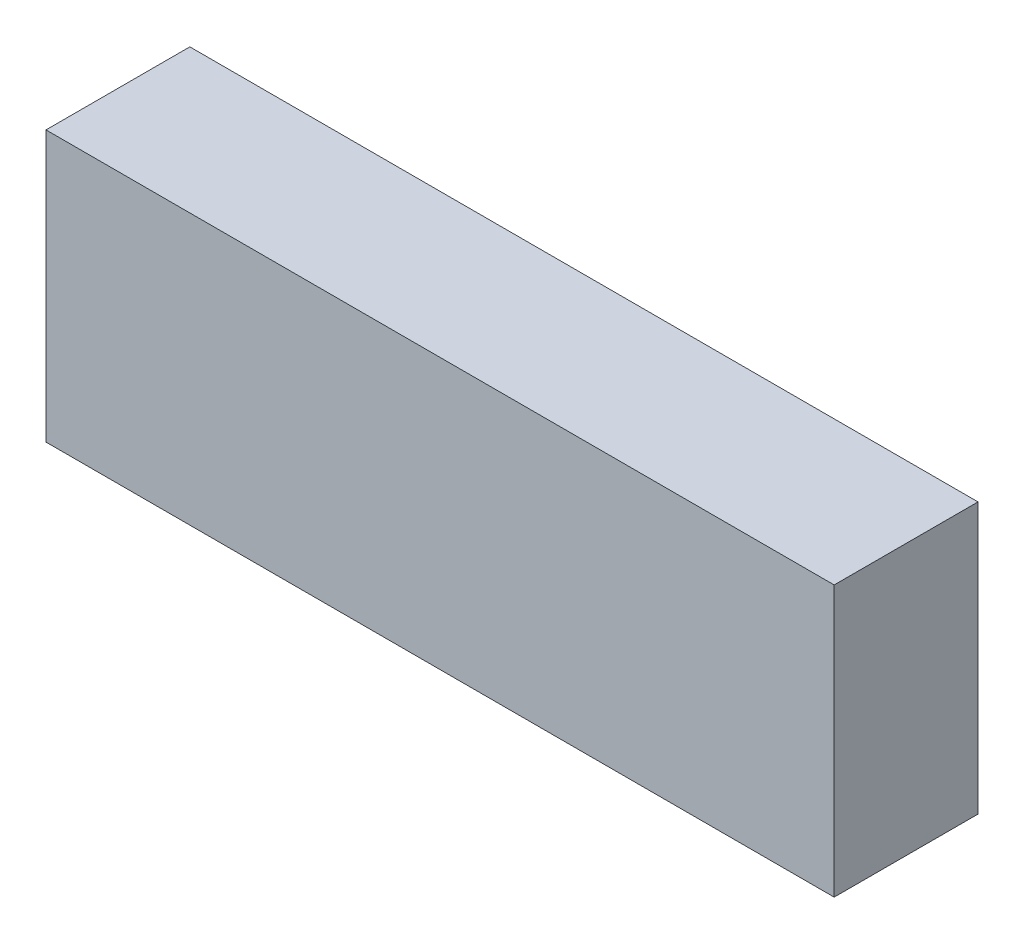
ISO-10303-21;
HEADER;
FILE_DESCRIPTION(('STEP AP214'),'2;1');
FILE_NAME('part.step','',(''),(''),'','','');
FILE_SCHEMA(('AUTOMOTIVE_DESIGN { 1 0 10303 214 1 1 1 1 }'));
ENDSEC;
DATA;
#1=APPLICATION_CONTEXT('core data for automotive mechanical design processes');
#2=APPLICATION_PROTOCOL_DEFINITION('international standard','automotive_design',2000,#1);
#3=PRODUCT_CONTEXT('',#1,'mechanical');
#4=PRODUCT('Part','Part','',(#3));
#5=PRODUCT_RELATED_PRODUCT_CATEGORY('part','',(#4));
#6=PRODUCT_DEFINITION_FORMATION('','',#4);
#7=PRODUCT_DEFINITION_CONTEXT('part definition',#1,'design');
#8=PRODUCT_DEFINITION('design','',#6,#7);
#9=PRODUCT_DEFINITION_SHAPE('','',#8);
#10=(LENGTH_UNIT() NAMED_UNIT(*) SI_UNIT(.MILLI.,.METRE.));
#11=(NAMED_UNIT(*) PLANE_ANGLE_UNIT() SI_UNIT($,.RADIAN.));
#12=(NAMED_UNIT(*) SI_UNIT($,.STERADIAN.) SOLID_ANGLE_UNIT());
#13=UNCERTAINTY_MEASURE_WITH_UNIT(LENGTH_MEASURE(1.E-05),#10,'distance_accuracy_value','');
#14=(GEOMETRIC_REPRESENTATION_CONTEXT(3) GLOBAL_UNCERTAINTY_ASSIGNED_CONTEXT((#13)) GLOBAL_UNIT_ASSIGNED_CONTEXT((#10,
#11,#12)) REPRESENTATION_CONTEXT('',''));
#15=CARTESIAN_POINT('',(0.,0.,0.));
#16=DIRECTION('',(0.,0.,1.));
#17=DIRECTION('',(1.,0.,0.));
#18=AXIS2_PLACEMENT_3D('',#15,#16,#17);
#19=CARTESIAN_POINT('',(64.0542117538615,65.399672220676,25.));
#20=DIRECTION('',(-1.,0.,0.));
#21=DIRECTION('',(0.,0.,1.));
#22=AXIS2_PLACEMENT_3D('',#19,#20,#21);
#23=PLANE('',#22);
#24=DIRECTION('',(0.,1.,0.));
#25=VECTOR('',#24,1.);
#26=CARTESIAN_POINT('',(64.0542117538615,65.399672220676,0.));
#27=LINE('',#26,#25);
#28=CARTESIAN_POINT('',(64.0542117538615,18.399672220676,0.));
#29=VERTEX_POINT('',#28);
#30=CARTESIAN_POINT('',(64.0542117538615,65.399672220676,0.));
#31=VERTEX_POINT('',#30);
#32=EDGE_CURVE('E102',#29,#31,#27,.T.);
#33=ORIENTED_EDGE('',*,*,#32,.T.);
#34=DIRECTION('',(0.,0.,-1.));
#35=VECTOR('',#34,1.);
#36=CARTESIAN_POINT('',(64.0542117538615,65.399672220676,25.));
#37=LINE('',#36,#35);
#38=CARTESIAN_POINT('',(64.0542117538615,65.399672220676,25.));
#39=VERTEX_POINT('',#38);
#40=EDGE_CURVE('E11',#39,#31,#37,.T.);
#41=ORIENTED_EDGE('',*,*,#40,.F.);
#42=DIRECTION('',(0.,1.,0.));
#43=VECTOR('',#42,1.);
#44=CARTESIAN_POINT('',(64.0542117538615,65.399672220676,25.));
#45=LINE('',#44,#43);
#46=CARTESIAN_POINT('',(64.0542117538615,18.399672220676,25.));
#47=VERTEX_POINT('',#46);
#48=EDGE_CURVE('E90',#47,#39,#45,.T.);
#49=ORIENTED_EDGE('',*,*,#48,.F.);
#50=DIRECTION('',(0.,0.,-1.));
#51=VECTOR('',#50,1.);
#52=CARTESIAN_POINT('',(64.0542117538615,18.399672220676,25.));
#53=LINE('',#52,#51);
#54=EDGE_CURVE('E98',#47,#29,#53,.T.);
#55=ORIENTED_EDGE('',*,*,#54,.T.);
#56=EDGE_LOOP('',(#33,#41,#49,#55));
#57=FACE_BOUND('',#56,.T.);
#58=ADVANCED_FACE('F39',(#57),#23,.F.);
#59=CARTESIAN_POINT('',(-72.9457882461386,65.399672220676,25.));
#60=DIRECTION('',(0.,-1.,0.));
#61=DIRECTION('',(0.,0.,-1.));
#62=AXIS2_PLACEMENT_3D('',#59,#60,#61);
#63=PLANE('',#62);
#64=DIRECTION('',(-1.,0.,0.));
#65=VECTOR('',#64,1.);
#66=CARTESIAN_POINT('',(-72.9457882461386,65.399672220676,0.));
#67=LINE('',#66,#65);
#68=CARTESIAN_POINT('',(-72.9457882461386,65.399672220676,0.));
#69=VERTEX_POINT('',#68);
#70=EDGE_CURVE('E94',#31,#69,#67,.T.);
#71=ORIENTED_EDGE('',*,*,#70,.T.);
#72=DIRECTION('',(0.,0.,-1.));
#73=VECTOR('',#72,1.);
#74=CARTESIAN_POINT('',(-72.9457882461386,65.399672220676,25.));
#75=LINE('',#74,#73);
#76=CARTESIAN_POINT('',(-72.9457882461386,65.399672220676,25.));
#77=VERTEX_POINT('',#76);
#78=EDGE_CURVE('E47',#77,#69,#75,.T.);
#79=ORIENTED_EDGE('',*,*,#78,.F.);
#80=DIRECTION('',(-1.,0.,0.));
#81=VECTOR('',#80,1.);
#82=CARTESIAN_POINT('',(-72.9457882461386,65.399672220676,25.));
#83=LINE('',#82,#81);
#84=EDGE_CURVE('E85',#39,#77,#83,.T.);
#85=ORIENTED_EDGE('',*,*,#84,.F.);
#86=ORIENTED_EDGE('',*,*,#40,.T.);
#87=EDGE_LOOP('',(#71,#79,#85,#86));
#88=FACE_BOUND('',#87,.T.);
#89=ADVANCED_FACE('F93',(#88),#63,.F.);
#90=CARTESIAN_POINT('',(-72.9457882461386,65.399672220676,25.));
#91=DIRECTION('',(1.,0.,0.));
#92=DIRECTION('',(0.,1.,0.));
#93=AXIS2_PLACEMENT_3D('',#90,#91,#92);
#94=PLANE('',#93);
#95=DIRECTION('',(0.,-1.,0.));
#96=VECTOR('',#95,1.);
#97=CARTESIAN_POINT('',(-72.9457882461386,65.399672220676,0.));
#98=LINE('',#97,#96);
#99=CARTESIAN_POINT('',(-72.9457882461385,18.399672220676,0.));
#100=VERTEX_POINT('',#99);
#101=EDGE_CURVE('E72',#69,#100,#98,.T.);
#102=ORIENTED_EDGE('',*,*,#101,.T.);
#103=DIRECTION('',(0.,0.,-1.));
#104=VECTOR('',#103,1.);
#105=CARTESIAN_POINT('',(-72.9457882461385,18.399672220676,25.));
#106=LINE('',#105,#104);
#107=CARTESIAN_POINT('',(-72.9457882461385,18.399672220676,25.));
#108=VERTEX_POINT('',#107);
#109=EDGE_CURVE('E95',#108,#100,#106,.T.);
#110=ORIENTED_EDGE('',*,*,#109,.F.);
#111=DIRECTION('',(0.,-1.,0.));
#112=VECTOR('',#111,1.);
#113=CARTESIAN_POINT('',(-72.9457882461386,65.399672220676,25.));
#114=LINE('',#113,#112);
#115=EDGE_CURVE('E88',#77,#108,#114,.T.);
#116=ORIENTED_EDGE('',*,*,#115,.F.);
#117=ORIENTED_EDGE('',*,*,#78,.T.);
#118=EDGE_LOOP('',(#102,#110,#116,#117));
#119=FACE_BOUND('',#118,.T.);
#120=ADVANCED_FACE('F96',(#119),#94,.F.);
#121=CARTESIAN_POINT('',(-72.9457882461385,18.399672220676,25.));
#122=DIRECTION('',(0.,1.,0.));
#123=DIRECTION('',(0.,0.,1.));
#124=AXIS2_PLACEMENT_3D('',#121,#122,#123);
#125=PLANE('',#124);
#126=DIRECTION('',(1.,0.,0.));
#127=VECTOR('',#126,1.);
#128=CARTESIAN_POINT('',(-72.9457882461385,18.399672220676,0.));
#129=LINE('',#128,#127);
#130=EDGE_CURVE('E78',#100,#29,#129,.T.);
#131=ORIENTED_EDGE('',*,*,#130,.T.);
#132=ORIENTED_EDGE('',*,*,#54,.F.);
#133=DIRECTION('',(1.,0.,0.));
#134=VECTOR('',#133,1.);
#135=CARTESIAN_POINT('',(-72.9457882461385,18.399672220676,25.));
#136=LINE('',#135,#134);
#137=EDGE_CURVE('E55',#108,#47,#136,.T.);
#138=ORIENTED_EDGE('',*,*,#137,.F.);
#139=ORIENTED_EDGE('',*,*,#109,.T.);
#140=EDGE_LOOP('',(#131,#132,#138,#139));
#141=FACE_BOUND('',#140,.T.);
#142=ADVANCED_FACE('F109',(#141),#125,.F.);
#143=CARTESIAN_POINT('',(0.,0.,25.));
#144=DIRECTION('',(0.,0.,1.));
#145=DIRECTION('',(1.,0.,0.));
#146=AXIS2_PLACEMENT_3D('',#143,#144,#145);
#147=PLANE('',#146);
#148=ORIENTED_EDGE('',*,*,#48,.T.);
#149=ORIENTED_EDGE('',*,*,#84,.T.);
#150=ORIENTED_EDGE('',*,*,#115,.T.);
#151=ORIENTED_EDGE('',*,*,#137,.T.);
#152=EDGE_LOOP('',(#148,#149,#150,#151));
#153=FACE_BOUND('',#152,.T.);
#154=ADVANCED_FACE('F86',(#153),#147,.T.);
#155=CARTESIAN_POINT('',(0.,0.,0.));
#156=DIRECTION('',(0.,0.,1.));
#157=DIRECTION('',(1.,0.,0.));
#158=AXIS2_PLACEMENT_3D('',#155,#156,#157);
#159=PLANE('',#158);
#160=ORIENTED_EDGE('',*,*,#32,.F.);
#161=ORIENTED_EDGE('',*,*,#130,.F.);
#162=ORIENTED_EDGE('',*,*,#101,.F.);
#163=ORIENTED_EDGE('',*,*,#70,.F.);
#164=EDGE_LOOP('',(#160,#161,#162,#163));
#165=FACE_BOUND('',#164,.T.);
#166=ADVANCED_FACE('F112',(#165),#159,.F.);
#167=CLOSED_SHELL('',(#58,#89,#120,#142,#154,#166));
#168=MANIFOLD_SOLID_BREP('B2',#167);
#169=ADVANCED_BREP_SHAPE_REPRESENTATION('',(#18,#168),#14);
#170=SHAPE_DEFINITION_REPRESENTATION(#9,#169);
ENDSEC;
END-ISO-10303-21;
